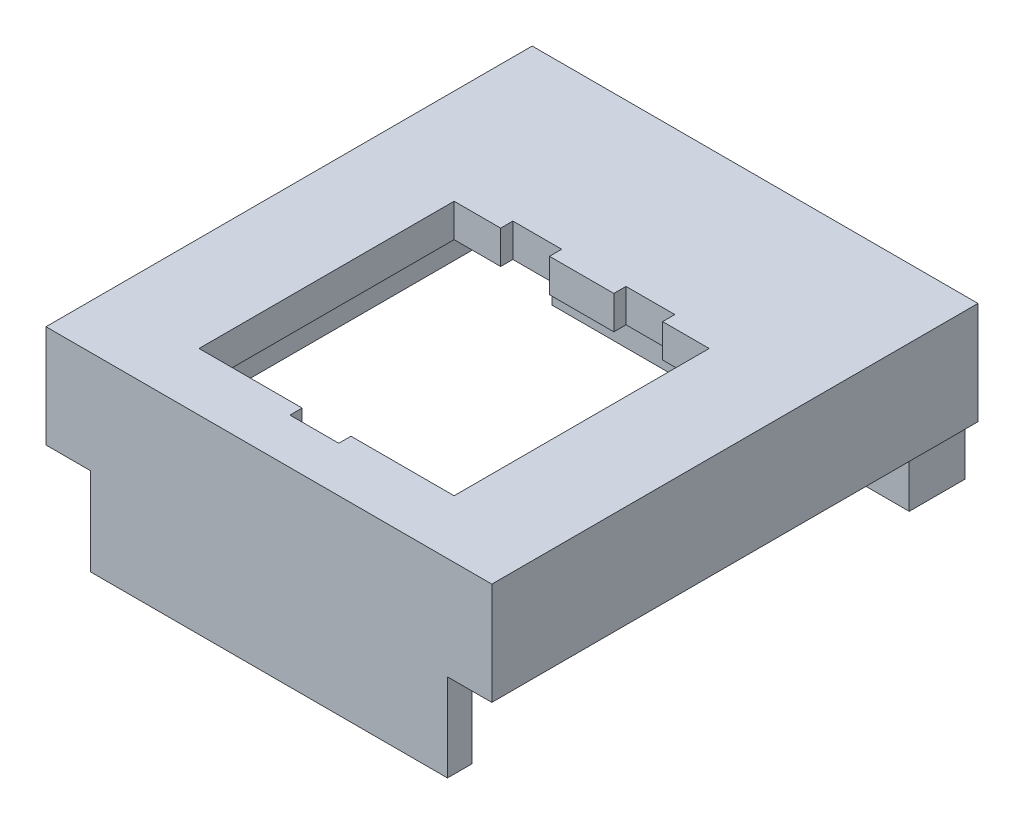
ISO-10303-21;
HEADER;
FILE_DESCRIPTION(('STEP AP214'),'2;1');
FILE_NAME('part.step','',(''),(''),'','','');
FILE_SCHEMA(('AUTOMOTIVE_DESIGN { 1 0 10303 214 1 1 1 1 }'));
ENDSEC;
DATA;
#1=APPLICATION_CONTEXT('core data for automotive mechanical design processes');
#2=APPLICATION_PROTOCOL_DEFINITION('international standard','automotive_design',2000,#1);
#3=PRODUCT_CONTEXT('',#1,'mechanical');
#4=PRODUCT('Part','Part','',(#3));
#5=PRODUCT_RELATED_PRODUCT_CATEGORY('part','',(#4));
#6=PRODUCT_DEFINITION_FORMATION('','',#4);
#7=PRODUCT_DEFINITION_CONTEXT('part definition',#1,'design');
#8=PRODUCT_DEFINITION('design','',#6,#7);
#9=PRODUCT_DEFINITION_SHAPE('','',#8);
#10=(LENGTH_UNIT() NAMED_UNIT(*) SI_UNIT(.MILLI.,.METRE.));
#11=(NAMED_UNIT(*) PLANE_ANGLE_UNIT() SI_UNIT($,.RADIAN.));
#12=(NAMED_UNIT(*) SI_UNIT($,.STERADIAN.) SOLID_ANGLE_UNIT());
#13=UNCERTAINTY_MEASURE_WITH_UNIT(LENGTH_MEASURE(1.E-05),#10,'distance_accuracy_value','');
#14=(GEOMETRIC_REPRESENTATION_CONTEXT(3) GLOBAL_UNCERTAINTY_ASSIGNED_CONTEXT((#13)) GLOBAL_UNIT_ASSIGNED_CONTEXT((#10,
#11,#12)) REPRESENTATION_CONTEXT('',''));
#15=CARTESIAN_POINT('',(0.,0.,0.));
#16=DIRECTION('',(0.,0.,1.));
#17=DIRECTION('',(1.,0.,0.));
#18=AXIS2_PLACEMENT_3D('',#15,#16,#17);
#19=CARTESIAN_POINT('',(-5.75000000000058,-3.95,-3.88999999999953));
#20=DIRECTION('',(0.,0.,-1.));
#21=DIRECTION('',(-1.,0.,0.));
#22=AXIS2_PLACEMENT_3D('',#19,#20,#21);
#23=PLANE('',#22);
#24=DIRECTION('',(-1.,0.,0.));
#25=VECTOR('',#24,1.);
#26=CARTESIAN_POINT('',(27.4281423258268,3.12,-3.88999999999953));
#27=LINE('',#26,#25);
#28=CARTESIAN_POINT('',(-3.65,3.12,-3.88999999999953));
#29=VERTEX_POINT('',#28);
#30=CARTESIAN_POINT('',(-5.75000000000058,3.12,-3.88999999999953));
#31=VERTEX_POINT('',#30);
#32=EDGE_CURVE('E380',#29,#31,#27,.T.);
#33=ORIENTED_EDGE('',*,*,#32,.F.);
#34=DIRECTION('',(0.,1.,0.));
#35=VECTOR('',#34,1.);
#36=CARTESIAN_POINT('',(-3.65,-3.95,-3.88999999999953));
#37=LINE('',#36,#35);
#38=CARTESIAN_POINT('',(-3.65,4.62,-3.88999999999953));
#39=VERTEX_POINT('',#38);
#40=EDGE_CURVE('E403',#29,#39,#37,.T.);
#41=ORIENTED_EDGE('',*,*,#40,.T.);
#42=DIRECTION('',(-1.,0.,0.));
#43=VECTOR('',#42,1.);
#44=CARTESIAN_POINT('',(-5.75000000000058,4.62,-3.88999999999953));
#45=LINE('',#44,#43);
#46=CARTESIAN_POINT('',(-5.75000000000058,4.62,-3.88999999999953));
#47=VERTEX_POINT('',#46);
#48=EDGE_CURVE('E487',#39,#47,#45,.T.);
#49=ORIENTED_EDGE('',*,*,#48,.T.);
#50=DIRECTION('',(0.,1.,0.));
#51=VECTOR('',#50,1.);
#52=CARTESIAN_POINT('',(-5.75000000000058,-3.95,-3.88999999999953));
#53=LINE('',#52,#51);
#54=EDGE_CURVE('E493',#31,#47,#53,.T.);
#55=ORIENTED_EDGE('',*,*,#54,.F.);
#56=EDGE_LOOP('',(#33,#41,#49,#55));
#57=FACE_BOUND('',#56,.T.);
#58=ADVANCED_FACE('F34',(#57),#23,.F.);
#59=CARTESIAN_POINT('',(1.45,4.62,-3.88999999999953));
#60=VERTEX_POINT('',#59);
#61=CARTESIAN_POINT('',(-1.45,4.62,-3.88999999999953));
#62=VERTEX_POINT('',#61);
#63=EDGE_CURVE('E492',#60,#62,#45,.T.);
#64=ORIENTED_EDGE('',*,*,#63,.T.);
#65=DIRECTION('',(0.,-1.,0.));
#66=VECTOR('',#65,1.);
#67=CARTESIAN_POINT('',(-1.45,-3.95,-3.88999999999953));
#68=LINE('',#67,#66);
#69=CARTESIAN_POINT('',(-1.45,3.12,-3.88999999999953));
#70=VERTEX_POINT('',#69);
#71=EDGE_CURVE('E400',#62,#70,#68,.T.);
#72=ORIENTED_EDGE('',*,*,#71,.T.);
#73=CARTESIAN_POINT('',(1.45,3.12,-3.88999999999953));
#74=VERTEX_POINT('',#73);
#75=EDGE_CURVE('E385',#74,#70,#27,.T.);
#76=ORIENTED_EDGE('',*,*,#75,.F.);
#77=DIRECTION('',(0.,1.,0.));
#78=VECTOR('',#77,1.);
#79=CARTESIAN_POINT('',(1.45,-3.95,-3.88999999999953));
#80=LINE('',#79,#78);
#81=EDGE_CURVE('E397',#74,#60,#80,.T.);
#82=ORIENTED_EDGE('',*,*,#81,.T.);
#83=EDGE_LOOP('',(#64,#72,#76,#82));
#84=FACE_BOUND('',#83,.T.);
#85=ADVANCED_FACE('F635',(#84),#23,.F.);
#86=CARTESIAN_POINT('',(5.75,-3.95,7.61));
#87=DIRECTION('',(0.,0.,1.));
#88=DIRECTION('',(1.,0.,0.));
#89=AXIS2_PLACEMENT_3D('',#86,#87,#88);
#90=PLANE('',#89);
#91=DIRECTION('',(1.,0.,0.));
#92=VECTOR('',#91,1.);
#93=CARTESIAN_POINT('',(5.75,4.62,7.61));
#94=LINE('',#93,#92);
#95=CARTESIAN_POINT('',(-5.75000000000058,4.62,7.61));
#96=VERTEX_POINT('',#95);
#97=CARTESIAN_POINT('',(-1.1,4.62,7.61));
#98=VERTEX_POINT('',#97);
#99=EDGE_CURVE('E481',#96,#98,#94,.T.);
#100=ORIENTED_EDGE('',*,*,#99,.T.);
#101=DIRECTION('',(0.,-1.,0.));
#102=VECTOR('',#101,1.);
#103=CARTESIAN_POINT('',(-1.1,-3.95,7.61));
#104=LINE('',#103,#102);
#105=CARTESIAN_POINT('',(-1.1,3.12,7.61));
#106=VERTEX_POINT('',#105);
#107=EDGE_CURVE('E391',#98,#106,#104,.T.);
#108=ORIENTED_EDGE('',*,*,#107,.T.);
#109=DIRECTION('',(1.,0.,0.));
#110=VECTOR('',#109,1.);
#111=CARTESIAN_POINT('',(27.4281423258268,3.12,7.61));
#112=LINE('',#111,#110);
#113=CARTESIAN_POINT('',(-5.75000000000058,3.12,7.61));
#114=VERTEX_POINT('',#113);
#115=EDGE_CURVE('E373',#114,#106,#112,.T.);
#116=ORIENTED_EDGE('',*,*,#115,.F.);
#117=DIRECTION('',(0.,1.,0.));
#118=VECTOR('',#117,1.);
#119=CARTESIAN_POINT('',(-5.75000000000058,-3.95,7.61));
#120=LINE('',#119,#118);
#121=EDGE_CURVE('E491',#114,#96,#120,.T.);
#122=ORIENTED_EDGE('',*,*,#121,.T.);
#123=EDGE_LOOP('',(#100,#108,#116,#122));
#124=FACE_BOUND('',#123,.T.);
#125=ADVANCED_FACE('F642',(#124),#90,.F.);
#126=CARTESIAN_POINT('',(-8.05,4.62,-10.21));
#127=DIRECTION('',(-1.,0.,0.));
#128=DIRECTION('',(0.,0.,1.));
#129=AXIS2_PLACEMENT_3D('',#126,#127,#128);
#130=PLANE('',#129);
#131=DIRECTION('',(0.,0.,-1.));
#132=VECTOR('',#131,1.);
#133=CARTESIAN_POINT('',(-8.05,3.12,9.11));
#134=LINE('',#133,#132);
#135=CARTESIAN_POINT('',(-8.05,3.12,9.11));
#136=VERTEX_POINT('',#135);
#137=CARTESIAN_POINT('',(-8.05,3.12,-10.61));
#138=VERTEX_POINT('',#137);
#139=EDGE_CURVE('E503',#136,#138,#134,.T.);
#140=ORIENTED_EDGE('',*,*,#139,.F.);
#141=DIRECTION('',(0.,1.,0.));
#142=VECTOR('',#141,1.);
#143=CARTESIAN_POINT('',(-8.05,-3.95,9.11));
#144=LINE('',#143,#142);
#145=CARTESIAN_POINT('',(-8.05,0.,9.11));
#146=VERTEX_POINT('',#145);
#147=EDGE_CURVE('E349',#146,#136,#144,.T.);
#148=ORIENTED_EDGE('',*,*,#147,.F.);
#149=DIRECTION('',(0.,0.,-1.));
#150=VECTOR('',#149,1.);
#151=CARTESIAN_POINT('',(-8.05,0.,-10.21));
#152=LINE('',#151,#150);
#153=CARTESIAN_POINT('',(-8.05,0.,-10.61));
#154=VERTEX_POINT('',#153);
#155=EDGE_CURVE('E366',#146,#154,#152,.T.);
#156=ORIENTED_EDGE('',*,*,#155,.T.);
#157=DIRECTION('',(0.,-1.,0.));
#158=VECTOR('',#157,1.);
#159=CARTESIAN_POINT('',(-8.05,19.2249681775532,-10.61));
#160=LINE('',#159,#158);
#161=EDGE_CURVE('E525',#138,#154,#160,.T.);
#162=ORIENTED_EDGE('',*,*,#161,.F.);
#163=EDGE_LOOP('',(#140,#148,#156,#162));
#164=FACE_BOUND('',#163,.T.);
#165=ADVANCED_FACE('F583',(#164),#130,.F.);
#166=CARTESIAN_POINT('',(-8.05,-3.95,9.11));
#167=DIRECTION('',(0.,0.,-1.));
#168=DIRECTION('',(-1.,0.,0.));
#169=AXIS2_PLACEMENT_3D('',#166,#167,#168);
#170=PLANE('',#169);
#171=ORIENTED_EDGE('',*,*,#147,.T.);
#172=DIRECTION('',(-1.,0.,0.));
#173=VECTOR('',#172,1.);
#174=CARTESIAN_POINT('',(27.4281423258268,3.12,9.11));
#175=LINE('',#174,#173);
#176=CARTESIAN_POINT('',(8.05,3.12,9.11));
#177=VERTEX_POINT('',#176);
#178=EDGE_CURVE('E295',#177,#136,#175,.T.);
#179=ORIENTED_EDGE('',*,*,#178,.F.);
#180=DIRECTION('',(0.,1.,0.));
#181=VECTOR('',#180,1.);
#182=CARTESIAN_POINT('',(8.05,-3.95,9.11));
#183=LINE('',#182,#181);
#184=CARTESIAN_POINT('',(8.05,0.,9.11));
#185=VERTEX_POINT('',#184);
#186=EDGE_CURVE('E352',#185,#177,#183,.T.);
#187=ORIENTED_EDGE('',*,*,#186,.F.);
#188=CARTESIAN_POINT('',(8.05,-3.95,9.11));
#189=VERTEX_POINT('',#188);
#190=EDGE_CURVE('E348',#189,#185,#183,.T.);
#191=ORIENTED_EDGE('',*,*,#190,.F.);
#192=DIRECTION('',(-1.,0.,0.));
#193=VECTOR('',#192,1.);
#194=CARTESIAN_POINT('',(-8.05,-3.95,9.11));
#195=LINE('',#194,#193);
#196=CARTESIAN_POINT('',(-8.05,-3.95,9.11));
#197=VERTEX_POINT('',#196);
#198=EDGE_CURVE('E340',#189,#197,#195,.T.);
#199=ORIENTED_EDGE('',*,*,#198,.T.);
#200=EDGE_CURVE('E344',#197,#146,#144,.T.);
#201=ORIENTED_EDGE('',*,*,#200,.T.);
#202=EDGE_LOOP('',(#171,#179,#187,#191,#199,#201));
#203=FACE_BOUND('',#202,.T.);
#204=ADVANCED_FACE('F580',(#203),#170,.T.);
#205=CARTESIAN_POINT('',(8.05,4.62,10.21));
#206=DIRECTION('',(1.,0.,0.));
#207=DIRECTION('',(0.,0.,-1.));
#208=AXIS2_PLACEMENT_3D('',#205,#206,#207);
#209=PLANE('',#208);
#210=DIRECTION('',(0.,0.,-1.));
#211=VECTOR('',#210,1.);
#212=CARTESIAN_POINT('',(8.05,3.12,9.11));
#213=LINE('',#212,#211);
#214=CARTESIAN_POINT('',(8.05,3.12,-10.61));
#215=VERTEX_POINT('',#214);
#216=EDGE_CURVE('E298',#177,#215,#213,.T.);
#217=ORIENTED_EDGE('',*,*,#216,.T.);
#218=DIRECTION('',(0.,-1.,0.));
#219=VECTOR('',#218,1.);
#220=CARTESIAN_POINT('',(8.05,19.2249681775532,-10.61));
#221=LINE('',#220,#219);
#222=CARTESIAN_POINT('',(8.05,0.,-10.61));
#223=VERTEX_POINT('',#222);
#224=EDGE_CURVE('E509',#215,#223,#221,.T.);
#225=ORIENTED_EDGE('',*,*,#224,.T.);
#226=DIRECTION('',(0.,0.,1.));
#227=VECTOR('',#226,1.);
#228=CARTESIAN_POINT('',(8.05,0.,10.21));
#229=LINE('',#228,#227);
#230=EDGE_CURVE('E321',#223,#185,#229,.T.);
#231=ORIENTED_EDGE('',*,*,#230,.T.);
#232=ORIENTED_EDGE('',*,*,#186,.T.);
#233=EDGE_LOOP('',(#217,#225,#231,#232));
#234=FACE_BOUND('',#233,.T.);
#235=ADVANCED_FACE('F508',(#234),#209,.F.);
#236=CARTESIAN_POINT('',(0.,0.,0.));
#237=DIRECTION('',(0.,1.,0.));
#238=DIRECTION('',(0.,0.,1.));
#239=AXIS2_PLACEMENT_3D('',#236,#237,#238);
#240=PLANE('',#239);
#241=DIRECTION('',(0.,0.,-1.));
#242=VECTOR('',#241,1.);
#243=CARTESIAN_POINT('',(-8.05,0.,-10.21));
#244=LINE('',#243,#242);
#245=CARTESIAN_POINT('',(-8.05,0.,-11.71));
#246=VERTEX_POINT('',#245);
#247=EDGE_CURVE('E292',#154,#246,#244,.T.);
#248=ORIENTED_EDGE('',*,*,#247,.F.);
#249=ORIENTED_EDGE('',*,*,#155,.F.);
#250=CARTESIAN_POINT('',(-8.05,0.,10.21));
#251=VERTEX_POINT('',#250);
#252=EDGE_CURVE('E367',#251,#146,#152,.T.);
#253=ORIENTED_EDGE('',*,*,#252,.F.);
#254=DIRECTION('',(1.,0.,0.));
#255=VECTOR('',#254,1.);
#256=CARTESIAN_POINT('',(-8.05,0.,10.21));
#257=LINE('',#256,#255);
#258=CARTESIAN_POINT('',(-10.05,0.,10.21));
#259=VERTEX_POINT('',#258);
#260=EDGE_CURVE('E347',#259,#251,#257,.T.);
#261=ORIENTED_EDGE('',*,*,#260,.F.);
#262=DIRECTION('',(0.,0.,1.));
#263=VECTOR('',#262,1.);
#264=CARTESIAN_POINT('',(-10.05,0.,-10.21));
#265=LINE('',#264,#263);
#266=CARTESIAN_POINT('',(-10.05,0.,-11.71));
#267=VERTEX_POINT('',#266);
#268=EDGE_CURVE('E361',#267,#259,#265,.T.);
#269=ORIENTED_EDGE('',*,*,#268,.F.);
#270=DIRECTION('',(-1.,0.,0.));
#271=VECTOR('',#270,1.);
#272=CARTESIAN_POINT('',(10.05,0.,-11.71));
#273=LINE('',#272,#271);
#274=EDGE_CURVE('E309',#246,#267,#273,.T.);
#275=ORIENTED_EDGE('',*,*,#274,.F.);
#276=EDGE_LOOP('',(#248,#249,#253,#261,#269,#275));
#277=FACE_BOUND('',#276,.T.);
#278=ADVANCED_FACE('F586',(#277),#240,.F.);
#279=DIRECTION('',(0.,0.,1.));
#280=VECTOR('',#279,1.);
#281=CARTESIAN_POINT('',(8.05,0.,-11.71));
#282=LINE('',#281,#280);
#283=CARTESIAN_POINT('',(8.05,0.,-11.71));
#284=VERTEX_POINT('',#283);
#285=EDGE_CURVE('E287',#284,#223,#282,.T.);
#286=ORIENTED_EDGE('',*,*,#285,.F.);
#287=CARTESIAN_POINT('',(10.05,0.,-11.71));
#288=VERTEX_POINT('',#287);
#289=EDGE_CURVE('E305',#288,#284,#273,.T.);
#290=ORIENTED_EDGE('',*,*,#289,.F.);
#291=DIRECTION('',(0.,0.,-1.));
#292=VECTOR('',#291,1.);
#293=CARTESIAN_POINT('',(10.05,0.,10.21));
#294=LINE('',#293,#292);
#295=CARTESIAN_POINT('',(10.05,0.,10.21));
#296=VERTEX_POINT('',#295);
#297=EDGE_CURVE('E324',#296,#288,#294,.T.);
#298=ORIENTED_EDGE('',*,*,#297,.F.);
#299=DIRECTION('',(1.,0.,0.));
#300=VECTOR('',#299,1.);
#301=CARTESIAN_POINT('',(8.05,0.,10.21));
#302=LINE('',#301,#300);
#303=CARTESIAN_POINT('',(8.05,0.,10.21));
#304=VERTEX_POINT('',#303);
#305=EDGE_CURVE('E315',#304,#296,#302,.T.);
#306=ORIENTED_EDGE('',*,*,#305,.F.);
#307=EDGE_CURVE('E328',#185,#304,#229,.T.);
#308=ORIENTED_EDGE('',*,*,#307,.F.);
#309=ORIENTED_EDGE('',*,*,#230,.F.);
#310=EDGE_LOOP('',(#286,#290,#298,#306,#308,#309));
#311=FACE_BOUND('',#310,.T.);
#312=ADVANCED_FACE('F603',(#311),#240,.F.);
#313=CARTESIAN_POINT('',(8.05,-3.95,9.11));
#314=DIRECTION('',(1.,0.,0.));
#315=DIRECTION('',(0.,0.,-1.));
#316=AXIS2_PLACEMENT_3D('',#313,#314,#315);
#317=PLANE('',#316);
#318=ORIENTED_EDGE('',*,*,#190,.T.);
#319=ORIENTED_EDGE('',*,*,#307,.T.);
#320=DIRECTION('',(0.,1.,0.));
#321=VECTOR('',#320,1.);
#322=CARTESIAN_POINT('',(8.05,-3.95,10.21));
#323=LINE('',#322,#321);
#324=CARTESIAN_POINT('',(8.05,-3.95,10.21));
#325=VERTEX_POINT('',#324);
#326=EDGE_CURVE('E353',#325,#304,#323,.T.);
#327=ORIENTED_EDGE('',*,*,#326,.F.);
#328=DIRECTION('',(0.,0.,-1.));
#329=VECTOR('',#328,1.);
#330=CARTESIAN_POINT('',(8.05,-3.95,9.11));
#331=LINE('',#330,#329);
#332=EDGE_CURVE('E337',#325,#189,#331,.T.);
#333=ORIENTED_EDGE('',*,*,#332,.T.);
#334=EDGE_LOOP('',(#318,#319,#327,#333));
#335=FACE_BOUND('',#334,.T.);
#336=ADVANCED_FACE('F598',(#335),#317,.T.);
#337=CARTESIAN_POINT('',(-8.05,4.62,10.21));
#338=DIRECTION('',(0.,0.,-1.));
#339=DIRECTION('',(-1.,0.,0.));
#340=AXIS2_PLACEMENT_3D('',#337,#338,#339);
#341=PLANE('',#340);
#342=ORIENTED_EDGE('',*,*,#260,.T.);
#343=DIRECTION('',(0.,1.,0.));
#344=VECTOR('',#343,1.);
#345=CARTESIAN_POINT('',(-8.05,-3.95,10.21));
#346=LINE('',#345,#344);
#347=CARTESIAN_POINT('',(-8.05,-3.95,10.21));
#348=VERTEX_POINT('',#347);
#349=EDGE_CURVE('E343',#348,#251,#346,.T.);
#350=ORIENTED_EDGE('',*,*,#349,.F.);
#351=DIRECTION('',(1.,0.,0.));
#352=VECTOR('',#351,1.);
#353=CARTESIAN_POINT('',(-8.05,-3.95,10.21));
#354=LINE('',#353,#352);
#355=EDGE_CURVE('E334',#348,#325,#354,.T.);
#356=ORIENTED_EDGE('',*,*,#355,.T.);
#357=ORIENTED_EDGE('',*,*,#326,.T.);
#358=ORIENTED_EDGE('',*,*,#305,.T.);
#359=DIRECTION('',(0.,-1.,0.));
#360=VECTOR('',#359,1.);
#361=CARTESIAN_POINT('',(10.05,4.62,10.21));
#362=LINE('',#361,#360);
#363=CARTESIAN_POINT('',(10.05,4.62,10.21));
#364=VERTEX_POINT('',#363);
#365=EDGE_CURVE('E320',#364,#296,#362,.T.);
#366=ORIENTED_EDGE('',*,*,#365,.F.);
#367=DIRECTION('',(1.,0.,0.));
#368=VECTOR('',#367,1.);
#369=CARTESIAN_POINT('',(-8.05,4.62,10.21));
#370=LINE('',#369,#368);
#371=CARTESIAN_POINT('',(-10.05,4.62,10.21));
#372=VERTEX_POINT('',#371);
#373=EDGE_CURVE('E358',#372,#364,#370,.T.);
#374=ORIENTED_EDGE('',*,*,#373,.F.);
#375=DIRECTION('',(0.,-1.,0.));
#376=VECTOR('',#375,1.);
#377=CARTESIAN_POINT('',(-10.05,4.62,10.21));
#378=LINE('',#377,#376);
#379=EDGE_CURVE('E363',#372,#259,#378,.T.);
#380=ORIENTED_EDGE('',*,*,#379,.T.);
#381=EDGE_LOOP('',(#342,#350,#356,#357,#358,#366,#374,#380));
#382=FACE_BOUND('',#381,.T.);
#383=ADVANCED_FACE('F36',(#382),#341,.F.);
#384=CARTESIAN_POINT('',(-10.05,4.62,-10.21));
#385=DIRECTION('',(1.,0.,0.));
#386=DIRECTION('',(0.,0.,-1.));
#387=AXIS2_PLACEMENT_3D('',#384,#385,#386);
#388=PLANE('',#387);
#389=ORIENTED_EDGE('',*,*,#268,.T.);
#390=ORIENTED_EDGE('',*,*,#379,.F.);
#391=DIRECTION('',(0.,0.,1.));
#392=VECTOR('',#391,1.);
#393=CARTESIAN_POINT('',(-10.05,4.62,-10.21));
#394=LINE('',#393,#392);
#395=CARTESIAN_POINT('',(-10.05,4.62,-11.71));
#396=VERTEX_POINT('',#395);
#397=EDGE_CURVE('E360',#396,#372,#394,.T.);
#398=ORIENTED_EDGE('',*,*,#397,.F.);
#399=DIRECTION('',(0.,1.,0.));
#400=VECTOR('',#399,1.);
#401=CARTESIAN_POINT('',(-10.05,0.,-11.71));
#402=LINE('',#401,#400);
#403=EDGE_CURVE('E312',#267,#396,#402,.T.);
#404=ORIENTED_EDGE('',*,*,#403,.F.);
#405=EDGE_LOOP('',(#389,#390,#398,#404));
#406=FACE_BOUND('',#405,.T.);
#407=ADVANCED_FACE('F614',(#406),#388,.F.);
#408=CARTESIAN_POINT('',(0.,4.62,0.));
#409=DIRECTION('',(0.,1.,0.));
#410=DIRECTION('',(0.,0.,1.));
#411=AXIS2_PLACEMENT_3D('',#408,#409,#410);
#412=PLANE('',#411);
#413=DIRECTION('',(0.,0.,1.));
#414=VECTOR('',#413,1.);
#415=CARTESIAN_POINT('',(-1.1,4.62,7.61));
#416=LINE('',#415,#414);
#417=CARTESIAN_POINT('',(-1.1,4.62,8.16));
#418=VERTEX_POINT('',#417);
#419=EDGE_CURVE('E431',#98,#418,#416,.T.);
#420=ORIENTED_EDGE('',*,*,#419,.F.);
#421=ORIENTED_EDGE('',*,*,#99,.F.);
#422=DIRECTION('',(0.,0.,1.));
#423=VECTOR('',#422,1.);
#424=CARTESIAN_POINT('',(-5.75000000000058,4.62,7.61));
#425=LINE('',#424,#423);
#426=EDGE_CURVE('E478',#47,#96,#425,.T.);
#427=ORIENTED_EDGE('',*,*,#426,.F.);
#428=ORIENTED_EDGE('',*,*,#48,.F.);
#429=DIRECTION('',(0.,0.,1.));
#430=VECTOR('',#429,1.);
#431=CARTESIAN_POINT('',(-3.65,4.62,-4.43999999999953));
#432=LINE('',#431,#430);
#433=CARTESIAN_POINT('',(-3.65,4.62,-4.43999999999953));
#434=VERTEX_POINT('',#433);
#435=EDGE_CURVE('E439',#434,#39,#432,.T.);
#436=ORIENTED_EDGE('',*,*,#435,.F.);
#437=DIRECTION('',(-1.,0.,0.));
#438=VECTOR('',#437,1.);
#439=CARTESIAN_POINT('',(-3.65,4.62,-4.43999999999953));
#440=LINE('',#439,#438);
#441=CARTESIAN_POINT('',(-1.45,4.62,-4.43999999999953));
#442=VERTEX_POINT('',#441);
#443=EDGE_CURVE('E445',#442,#434,#440,.T.);
#444=ORIENTED_EDGE('',*,*,#443,.F.);
#445=DIRECTION('',(0.,0.,-1.));
#446=VECTOR('',#445,1.);
#447=CARTESIAN_POINT('',(-1.45,4.62,-4.43999999999953));
#448=LINE('',#447,#446);
#449=EDGE_CURVE('E441',#62,#442,#448,.T.);
#450=ORIENTED_EDGE('',*,*,#449,.F.);
#451=ORIENTED_EDGE('',*,*,#63,.F.);
#452=DIRECTION('',(0.,0.,1.));
#453=VECTOR('',#452,1.);
#454=CARTESIAN_POINT('',(1.45,4.62,-4.43999999999953));
#455=LINE('',#454,#453);
#456=CARTESIAN_POINT('',(1.45,4.62,-4.43999999999953));
#457=VERTEX_POINT('',#456);
#458=EDGE_CURVE('E452',#457,#60,#455,.T.);
#459=ORIENTED_EDGE('',*,*,#458,.F.);
#460=DIRECTION('',(-1.,0.,0.));
#461=VECTOR('',#460,1.);
#462=CARTESIAN_POINT('',(1.45,4.62,-4.43999999999953));
#463=LINE('',#462,#461);
#464=CARTESIAN_POINT('',(3.65,4.62,-4.43999999999953));
#465=VERTEX_POINT('',#464);
#466=EDGE_CURVE('E458',#465,#457,#463,.T.);
#467=ORIENTED_EDGE('',*,*,#466,.F.);
#468=DIRECTION('',(0.,0.,-1.));
#469=VECTOR('',#468,1.);
#470=CARTESIAN_POINT('',(3.65,4.62,-4.43999999999953));
#471=LINE('',#470,#469);
#472=CARTESIAN_POINT('',(3.65,4.62,-3.88999999999953));
#473=VERTEX_POINT('',#472);
#474=EDGE_CURVE('E454',#473,#465,#471,.T.);
#475=ORIENTED_EDGE('',*,*,#474,.F.);
#476=CARTESIAN_POINT('',(5.75,4.62,-3.88999999999953));
#477=VERTEX_POINT('',#476);
#478=EDGE_CURVE('E488',#477,#473,#45,.T.);
#479=ORIENTED_EDGE('',*,*,#478,.F.);
#480=DIRECTION('',(0.,0.,-1.));
#481=VECTOR('',#480,1.);
#482=CARTESIAN_POINT('',(5.75,4.62,7.61));
#483=LINE('',#482,#481);
#484=CARTESIAN_POINT('',(5.75,4.62,7.61));
#485=VERTEX_POINT('',#484);
#486=EDGE_CURVE('E484',#485,#477,#483,.T.);
#487=ORIENTED_EDGE('',*,*,#486,.F.);
#488=CARTESIAN_POINT('',(1.1,4.62,7.61));
#489=VERTEX_POINT('',#488);
#490=EDGE_CURVE('E480',#489,#485,#94,.T.);
#491=ORIENTED_EDGE('',*,*,#490,.F.);
#492=DIRECTION('',(0.,0.,-1.));
#493=VECTOR('',#492,1.);
#494=CARTESIAN_POINT('',(1.1,4.62,7.61));
#495=LINE('',#494,#493);
#496=CARTESIAN_POINT('',(1.1,4.62,8.16));
#497=VERTEX_POINT('',#496);
#498=EDGE_CURVE('E433',#497,#489,#495,.T.);
#499=ORIENTED_EDGE('',*,*,#498,.F.);
#500=DIRECTION('',(1.,0.,0.));
#501=VECTOR('',#500,1.);
#502=CARTESIAN_POINT('',(-1.1,4.62,8.16));
#503=LINE('',#502,#501);
#504=EDGE_CURVE('E436',#418,#497,#503,.T.);
#505=ORIENTED_EDGE('',*,*,#504,.F.);
#506=EDGE_LOOP('',(#420,#421,#427,#428,#436,#444,#450,#451,#459,#467,#475,#479,#487,#491,#499,#505));
#507=FACE_BOUND('',#506,.T.);
#508=DIRECTION('',(-1.,0.,0.));
#509=VECTOR('',#508,1.);
#510=CARTESIAN_POINT('',(10.05,4.62,-11.71));
#511=LINE('',#510,#509);
#512=CARTESIAN_POINT('',(10.05,4.62,-11.71));
#513=VERTEX_POINT('',#512);
#514=EDGE_CURVE('E304',#513,#396,#511,.T.);
#515=ORIENTED_EDGE('',*,*,#514,.T.);
#516=ORIENTED_EDGE('',*,*,#397,.T.);
#517=ORIENTED_EDGE('',*,*,#373,.T.);
#518=DIRECTION('',(0.,0.,-1.));
#519=VECTOR('',#518,1.);
#520=CARTESIAN_POINT('',(10.05,4.62,10.21));
#521=LINE('',#520,#519);
#522=EDGE_CURVE('E318',#364,#513,#521,.T.);
#523=ORIENTED_EDGE('',*,*,#522,.T.);
#524=EDGE_LOOP('',(#515,#516,#517,#523));
#525=FACE_BOUND('',#524,.T.);
#526=ADVANCED_FACE('F567',(#507,#525),#412,.T.);
#527=CARTESIAN_POINT('',(-8.05,-3.95,10.21));
#528=DIRECTION('',(-1.,0.,0.));
#529=DIRECTION('',(0.,0.,1.));
#530=AXIS2_PLACEMENT_3D('',#527,#528,#529);
#531=PLANE('',#530);
#532=ORIENTED_EDGE('',*,*,#349,.T.);
#533=ORIENTED_EDGE('',*,*,#252,.T.);
#534=ORIENTED_EDGE('',*,*,#200,.F.);
#535=DIRECTION('',(0.,0.,1.));
#536=VECTOR('',#535,1.);
#537=CARTESIAN_POINT('',(-8.05,-3.95,10.21));
#538=LINE('',#537,#536);
#539=EDGE_CURVE('E331',#197,#348,#538,.T.);
#540=ORIENTED_EDGE('',*,*,#539,.T.);
#541=EDGE_LOOP('',(#532,#533,#534,#540));
#542=FACE_BOUND('',#541,.T.);
#543=ADVANCED_FACE('F590',(#542),#531,.T.);
#544=CARTESIAN_POINT('',(0.,-3.95,0.));
#545=DIRECTION('',(0.,-1.,0.));
#546=DIRECTION('',(0.,0.,-1.));
#547=AXIS2_PLACEMENT_3D('',#544,#545,#546);
#548=PLANE('',#547);
#549=ORIENTED_EDGE('',*,*,#539,.F.);
#550=ORIENTED_EDGE('',*,*,#198,.F.);
#551=ORIENTED_EDGE('',*,*,#332,.F.);
#552=ORIENTED_EDGE('',*,*,#355,.F.);
#553=EDGE_LOOP('',(#549,#550,#551,#552));
#554=FACE_BOUND('',#553,.T.);
#555=ADVANCED_FACE('F596',(#554),#548,.T.);
#556=CARTESIAN_POINT('',(10.05,4.62,10.21));
#557=DIRECTION('',(-1.,0.,0.));
#558=DIRECTION('',(0.,0.,1.));
#559=AXIS2_PLACEMENT_3D('',#556,#557,#558);
#560=PLANE('',#559);
#561=ORIENTED_EDGE('',*,*,#297,.T.);
#562=DIRECTION('',(0.,1.,0.));
#563=VECTOR('',#562,1.);
#564=CARTESIAN_POINT('',(10.05,0.,-11.71));
#565=LINE('',#564,#563);
#566=EDGE_CURVE('E308',#288,#513,#565,.T.);
#567=ORIENTED_EDGE('',*,*,#566,.T.);
#568=ORIENTED_EDGE('',*,*,#522,.F.);
#569=ORIENTED_EDGE('',*,*,#365,.T.);
#570=EDGE_LOOP('',(#561,#567,#568,#569));
#571=FACE_BOUND('',#570,.T.);
#572=ADVANCED_FACE('F608',(#571),#560,.F.);
#573=CARTESIAN_POINT('',(10.05,0.,-11.71));
#574=DIRECTION('',(0.,0.,-1.));
#575=DIRECTION('',(-1.,0.,0.));
#576=AXIS2_PLACEMENT_3D('',#573,#574,#575);
#577=PLANE('',#576);
#578=DIRECTION('',(1.,0.,0.));
#579=VECTOR('',#578,1.);
#580=CARTESIAN_POINT('',(8.05,-1.65,-11.71));
#581=LINE('',#580,#579);
#582=CARTESIAN_POINT('',(-8.05,-1.65,-11.71));
#583=VERTEX_POINT('',#582);
#584=CARTESIAN_POINT('',(8.05,-1.65,-11.71));
#585=VERTEX_POINT('',#584);
#586=EDGE_CURVE('E538',#583,#585,#581,.T.);
#587=ORIENTED_EDGE('',*,*,#586,.F.);
#588=DIRECTION('',(0.,1.,0.));
#589=VECTOR('',#588,1.);
#590=CARTESIAN_POINT('',(-8.05,-3.95,-11.71));
#591=LINE('',#590,#589);
#592=EDGE_CURVE('E301',#583,#246,#591,.T.);
#593=ORIENTED_EDGE('',*,*,#592,.T.);
#594=ORIENTED_EDGE('',*,*,#274,.T.);
#595=ORIENTED_EDGE('',*,*,#403,.T.);
#596=ORIENTED_EDGE('',*,*,#514,.F.);
#597=ORIENTED_EDGE('',*,*,#566,.F.);
#598=ORIENTED_EDGE('',*,*,#289,.T.);
#599=DIRECTION('',(0.,1.,0.));
#600=VECTOR('',#599,1.);
#601=CARTESIAN_POINT('',(8.05,-3.95,-11.71));
#602=LINE('',#601,#600);
#603=EDGE_CURVE('E289',#585,#284,#602,.T.);
#604=ORIENTED_EDGE('',*,*,#603,.F.);
#605=EDGE_LOOP('',(#587,#593,#594,#595,#596,#597,#598,#604));
#606=FACE_BOUND('',#605,.T.);
#607=DIRECTION('',(-1.,0.,0.));
#608=VECTOR('',#607,1.);
#609=CARTESIAN_POINT('',(-4.481119636084,-0.971119636083997,-11.71));
#610=LINE('',#609,#608);
#611=CARTESIAN_POINT('',(3.64000000000001,-0.971119636083998,-11.71));
#612=VERTEX_POINT('',#611);
#613=CARTESIAN_POINT('',(-4.481119636084,-0.971119636083997,-11.71));
#614=VERTEX_POINT('',#613);
#615=EDGE_CURVE('E544',#612,#614,#610,.T.);
#616=ORIENTED_EDGE('',*,*,#615,.F.);
#617=DIRECTION('',(0.,-1.,0.));
#618=VECTOR('',#617,1.);
#619=CARTESIAN_POINT('',(3.64,2.1,-11.71));
#620=LINE('',#619,#618);
#621=CARTESIAN_POINT('',(3.64,2.1,-11.71));
#622=VERTEX_POINT('',#621);
#623=EDGE_CURVE('E553',#622,#612,#620,.T.);
#624=ORIENTED_EDGE('',*,*,#623,.F.);
#625=DIRECTION('',(1.,0.,0.));
#626=VECTOR('',#625,1.);
#627=CARTESIAN_POINT('',(-4.481119636084,2.1,-11.71));
#628=LINE('',#627,#626);
#629=CARTESIAN_POINT('',(-4.481119636084,2.1,-11.71));
#630=VERTEX_POINT('',#629);
#631=EDGE_CURVE('E550',#630,#622,#628,.T.);
#632=ORIENTED_EDGE('',*,*,#631,.F.);
#633=DIRECTION('',(0.,1.,0.));
#634=VECTOR('',#633,1.);
#635=CARTESIAN_POINT('',(-4.481119636084,-0.971119636083997,-11.71));
#636=LINE('',#635,#634);
#637=EDGE_CURVE('E547',#614,#630,#636,.T.);
#638=ORIENTED_EDGE('',*,*,#637,.F.);
#639=EDGE_LOOP('',(#616,#624,#632,#638));
#640=FACE_BOUND('',#639,.T.);
#641=ADVANCED_FACE('F617',(#606,#640),#577,.T.);
#642=CARTESIAN_POINT('',(-8.05,-3.95,-10.21));
#643=DIRECTION('',(1.,0.,0.));
#644=DIRECTION('',(0.,0.,-1.));
#645=AXIS2_PLACEMENT_3D('',#642,#643,#644);
#646=PLANE('',#645);
#647=DIRECTION('',(0.,0.,1.));
#648=VECTOR('',#647,1.);
#649=CARTESIAN_POINT('',(-8.05,-1.65,-13.79));
#650=LINE('',#649,#648);
#651=CARTESIAN_POINT('',(-8.05,-1.65,-13.1159664953668));
#652=VERTEX_POINT('',#651);
#653=EDGE_CURVE('E280',#652,#583,#650,.T.);
#654=ORIENTED_EDGE('',*,*,#653,.F.);
#655=DIRECTION('',(0.,1.,0.));
#656=VECTOR('',#655,1.);
#657=CARTESIAN_POINT('',(-8.05,0.,-13.1159664953668));
#658=LINE('',#657,#656);
#659=CARTESIAN_POINT('',(-8.05,-3.95,-13.1159664953668));
#660=VERTEX_POINT('',#659);
#661=EDGE_CURVE('E49',#660,#652,#658,.T.);
#662=ORIENTED_EDGE('',*,*,#661,.F.);
#663=DIRECTION('',(0.,0.,-1.));
#664=VECTOR('',#663,1.);
#665=CARTESIAN_POINT('',(-8.05,-3.95,-10.21));
#666=LINE('',#665,#664);
#667=CARTESIAN_POINT('',(-8.05,-3.95,-10.61));
#668=VERTEX_POINT('',#667);
#669=EDGE_CURVE('E278',#668,#660,#666,.T.);
#670=ORIENTED_EDGE('',*,*,#669,.F.);
#671=EDGE_CURVE('E527',#154,#668,#160,.T.);
#672=ORIENTED_EDGE('',*,*,#671,.F.);
#673=ORIENTED_EDGE('',*,*,#247,.T.);
#674=ORIENTED_EDGE('',*,*,#592,.F.);
#675=EDGE_LOOP('',(#654,#662,#670,#672,#673,#674));
#676=FACE_BOUND('',#675,.T.);
#677=ADVANCED_FACE('F276',(#676),#646,.F.);
#678=CARTESIAN_POINT('',(8.05,-3.95,-11.71));
#679=DIRECTION('',(-1.,0.,0.));
#680=DIRECTION('',(0.,0.,1.));
#681=AXIS2_PLACEMENT_3D('',#678,#679,#680);
#682=PLANE('',#681);
#683=DIRECTION('',(0.,0.,1.));
#684=VECTOR('',#683,1.);
#685=CARTESIAN_POINT('',(8.05,-3.95,-11.71));
#686=LINE('',#685,#684);
#687=CARTESIAN_POINT('',(8.05,-3.95,-13.1159664953668));
#688=VERTEX_POINT('',#687);
#689=CARTESIAN_POINT('',(8.05,-3.95,-10.61));
#690=VERTEX_POINT('',#689);
#691=EDGE_CURVE('E286',#688,#690,#686,.T.);
#692=ORIENTED_EDGE('',*,*,#691,.F.);
#693=DIRECTION('',(0.,1.,0.));
#694=VECTOR('',#693,1.);
#695=CARTESIAN_POINT('',(8.05,-3.95,-13.1159664953668));
#696=LINE('',#695,#694);
#697=CARTESIAN_POINT('',(8.05,-1.65,-13.1159664953668));
#698=VERTEX_POINT('',#697);
#699=EDGE_CURVE('E267',#688,#698,#696,.T.);
#700=ORIENTED_EDGE('',*,*,#699,.T.);
#701=DIRECTION('',(0.,0.,1.));
#702=VECTOR('',#701,1.);
#703=CARTESIAN_POINT('',(8.05,-1.65,-13.79));
#704=LINE('',#703,#702);
#705=EDGE_CURVE('E541',#698,#585,#704,.T.);
#706=ORIENTED_EDGE('',*,*,#705,.T.);
#707=ORIENTED_EDGE('',*,*,#603,.T.);
#708=ORIENTED_EDGE('',*,*,#285,.T.);
#709=EDGE_CURVE('E521',#223,#690,#221,.T.);
#710=ORIENTED_EDGE('',*,*,#709,.T.);
#711=EDGE_LOOP('',(#692,#700,#706,#707,#708,#710));
#712=FACE_BOUND('',#711,.T.);
#713=ADVANCED_FACE('F625',(#712),#682,.F.);
#714=CARTESIAN_POINT('',(0.,-3.95,0.));
#715=DIRECTION('',(0.,-1.,0.));
#716=DIRECTION('',(0.,0.,-1.));
#717=AXIS2_PLACEMENT_3D('',#714,#715,#716);
#718=PLANE('',#717);
#719=DIRECTION('',(-1.,0.,0.));
#720=VECTOR('',#719,1.);
#721=CARTESIAN_POINT('',(10.05,-3.95,-13.1159664953668));
#722=LINE('',#721,#720);
#723=EDGE_CURVE('E264',#688,#660,#722,.T.);
#724=ORIENTED_EDGE('',*,*,#723,.F.);
#725=ORIENTED_EDGE('',*,*,#691,.T.);
#726=DIRECTION('',(1.,0.,0.));
#727=VECTOR('',#726,1.);
#728=CARTESIAN_POINT('',(8.05,-3.95,-10.61));
#729=LINE('',#728,#727);
#730=EDGE_CURVE('E285',#668,#690,#729,.T.);
#731=ORIENTED_EDGE('',*,*,#730,.F.);
#732=ORIENTED_EDGE('',*,*,#669,.T.);
#733=EDGE_LOOP('',(#724,#725,#731,#732));
#734=FACE_BOUND('',#733,.T.);
#735=ADVANCED_FACE('F283',(#734),#718,.T.);
#736=CARTESIAN_POINT('',(27.4281423258268,3.12,9.11));
#737=DIRECTION('',(0.,1.,0.));
#738=DIRECTION('',(0.,0.,1.));
#739=AXIS2_PLACEMENT_3D('',#736,#737,#738);
#740=PLANE('',#739);
#741=ORIENTED_EDGE('',*,*,#115,.T.);
#742=DIRECTION('',(0.,0.,1.));
#743=VECTOR('',#742,1.);
#744=CARTESIAN_POINT('',(-1.1,3.12,9.11));
#745=LINE('',#744,#743);
#746=CARTESIAN_POINT('',(-1.1,3.12,8.16));
#747=VERTEX_POINT('',#746);
#748=EDGE_CURVE('E419',#106,#747,#745,.T.);
#749=ORIENTED_EDGE('',*,*,#748,.T.);
#750=DIRECTION('',(1.,0.,0.));
#751=VECTOR('',#750,1.);
#752=CARTESIAN_POINT('',(27.4281423258268,3.12,8.16));
#753=LINE('',#752,#751);
#754=CARTESIAN_POINT('',(1.1,3.12,8.16));
#755=VERTEX_POINT('',#754);
#756=EDGE_CURVE('E42',#747,#755,#753,.T.);
#757=ORIENTED_EDGE('',*,*,#756,.T.);
#758=DIRECTION('',(0.,0.,-1.));
#759=VECTOR('',#758,1.);
#760=CARTESIAN_POINT('',(1.1,3.12,9.11));
#761=LINE('',#760,#759);
#762=CARTESIAN_POINT('',(1.1,3.12,7.61));
#763=VERTEX_POINT('',#762);
#764=EDGE_CURVE('E417',#755,#763,#761,.T.);
#765=ORIENTED_EDGE('',*,*,#764,.T.);
#766=CARTESIAN_POINT('',(5.75,3.12,7.61));
#767=VERTEX_POINT('',#766);
#768=EDGE_CURVE('E377',#763,#767,#112,.T.);
#769=ORIENTED_EDGE('',*,*,#768,.T.);
#770=DIRECTION('',(0.,0.,-1.));
#771=VECTOR('',#770,1.);
#772=CARTESIAN_POINT('',(5.75000000000001,3.12,9.11));
#773=LINE('',#772,#771);
#774=CARTESIAN_POINT('',(5.75,3.12,-3.88999999999953));
#775=VERTEX_POINT('',#774);
#776=EDGE_CURVE('E376',#767,#775,#773,.T.);
#777=ORIENTED_EDGE('',*,*,#776,.T.);
#778=CARTESIAN_POINT('',(3.65,3.12,-3.88999999999953));
#779=VERTEX_POINT('',#778);
#780=EDGE_CURVE('E381',#775,#779,#27,.T.);
#781=ORIENTED_EDGE('',*,*,#780,.T.);
#782=DIRECTION('',(0.,0.,-1.));
#783=VECTOR('',#782,1.);
#784=CARTESIAN_POINT('',(3.65,3.12,9.11));
#785=LINE('',#784,#783);
#786=CARTESIAN_POINT('',(3.65,3.12,-4.43999999999953));
#787=VERTEX_POINT('',#786);
#788=EDGE_CURVE('E466',#779,#787,#785,.T.);
#789=ORIENTED_EDGE('',*,*,#788,.T.);
#790=DIRECTION('',(-1.,0.,0.));
#791=VECTOR('',#790,1.);
#792=CARTESIAN_POINT('',(27.4281423258268,3.12,-4.43999999999955));
#793=LINE('',#792,#791);
#794=CARTESIAN_POINT('',(1.45,3.12,-4.43999999999953));
#795=VERTEX_POINT('',#794);
#796=EDGE_CURVE('E406',#787,#795,#793,.T.);
#797=ORIENTED_EDGE('',*,*,#796,.T.);
#798=DIRECTION('',(0.,0.,1.));
#799=VECTOR('',#798,1.);
#800=CARTESIAN_POINT('',(1.45000000000001,3.12,9.11000000000001));
#801=LINE('',#800,#799);
#802=EDGE_CURVE('E469',#795,#74,#801,.T.);
#803=ORIENTED_EDGE('',*,*,#802,.T.);
#804=ORIENTED_EDGE('',*,*,#75,.T.);
#805=DIRECTION('',(0.,0.,-1.));
#806=VECTOR('',#805,1.);
#807=CARTESIAN_POINT('',(-1.45000000000001,3.12,9.10999999999998));
#808=LINE('',#807,#806);
#809=CARTESIAN_POINT('',(-1.45,3.12,-4.43999999999953));
#810=VERTEX_POINT('',#809);
#811=EDGE_CURVE('E472',#70,#810,#808,.T.);
#812=ORIENTED_EDGE('',*,*,#811,.T.);
#813=DIRECTION('',(-1.,0.,0.));
#814=VECTOR('',#813,1.);
#815=CARTESIAN_POINT('',(27.4281423258268,3.12,-4.43999999999953));
#816=LINE('',#815,#814);
#817=CARTESIAN_POINT('',(-3.65,3.12,-4.43999999999953));
#818=VERTEX_POINT('',#817);
#819=EDGE_CURVE('E409',#810,#818,#816,.T.);
#820=ORIENTED_EDGE('',*,*,#819,.T.);
#821=DIRECTION('',(0.,0.,1.));
#822=VECTOR('',#821,1.);
#823=CARTESIAN_POINT('',(-3.65,3.12,9.11));
#824=LINE('',#823,#822);
#825=EDGE_CURVE('E475',#818,#29,#824,.T.);
#826=ORIENTED_EDGE('',*,*,#825,.T.);
#827=ORIENTED_EDGE('',*,*,#32,.T.);
#828=DIRECTION('',(0.,0.,1.));
#829=VECTOR('',#828,1.);
#830=CARTESIAN_POINT('',(-5.75000000000058,3.12,9.11));
#831=LINE('',#830,#829);
#832=EDGE_CURVE('E384',#31,#114,#831,.T.);
#833=ORIENTED_EDGE('',*,*,#832,.T.);
#834=EDGE_LOOP('',(#741,#749,#757,#765,#769,#777,#781,#789,#797,#803,#804,#812,#820,#826,#827,#833));
#835=FACE_BOUND('',#834,.T.);
#836=ORIENTED_EDGE('',*,*,#216,.F.);
#837=ORIENTED_EDGE('',*,*,#178,.T.);
#838=ORIENTED_EDGE('',*,*,#139,.T.);
#839=DIRECTION('',(1.,0.,0.));
#840=VECTOR('',#839,1.);
#841=CARTESIAN_POINT('',(8.05,3.12,-10.61));
#842=LINE('',#841,#840);
#843=EDGE_CURVE('E518',#138,#215,#842,.T.);
#844=ORIENTED_EDGE('',*,*,#843,.T.);
#845=EDGE_LOOP('',(#836,#837,#838,#844));
#846=FACE_BOUND('',#845,.T.);
#847=ADVANCED_FACE('F415',(#835,#846),#740,.F.);
#848=CARTESIAN_POINT('',(-5.75000000000058,-3.95,7.61));
#849=DIRECTION('',(-1.,0.,0.));
#850=DIRECTION('',(0.,0.,1.));
#851=AXIS2_PLACEMENT_3D('',#848,#849,#850);
#852=PLANE('',#851);
#853=ORIENTED_EDGE('',*,*,#54,.T.);
#854=ORIENTED_EDGE('',*,*,#426,.T.);
#855=ORIENTED_EDGE('',*,*,#121,.F.);
#856=ORIENTED_EDGE('',*,*,#832,.F.);
#857=EDGE_LOOP('',(#853,#854,#855,#856));
#858=FACE_BOUND('',#857,.T.);
#859=ADVANCED_FACE('F649',(#858),#852,.F.);
#860=ORIENTED_EDGE('',*,*,#478,.T.);
#861=DIRECTION('',(0.,-1.,0.));
#862=VECTOR('',#861,1.);
#863=CARTESIAN_POINT('',(3.65,-3.95,-3.88999999999953));
#864=LINE('',#863,#862);
#865=EDGE_CURVE('E394',#473,#779,#864,.T.);
#866=ORIENTED_EDGE('',*,*,#865,.T.);
#867=ORIENTED_EDGE('',*,*,#780,.F.);
#868=DIRECTION('',(0.,1.,0.));
#869=VECTOR('',#868,1.);
#870=CARTESIAN_POINT('',(5.75,-3.95,-3.88999999999953));
#871=LINE('',#870,#869);
#872=EDGE_CURVE('E496',#775,#477,#871,.T.);
#873=ORIENTED_EDGE('',*,*,#872,.T.);
#874=EDGE_LOOP('',(#860,#866,#867,#873));
#875=FACE_BOUND('',#874,.T.);
#876=ADVANCED_FACE('F638',(#875),#23,.F.);
#877=CARTESIAN_POINT('',(5.75,-3.95,7.61));
#878=DIRECTION('',(1.,0.,0.));
#879=DIRECTION('',(0.,0.,-1.));
#880=AXIS2_PLACEMENT_3D('',#877,#878,#879);
#881=PLANE('',#880);
#882=DIRECTION('',(0.,1.,0.));
#883=VECTOR('',#882,1.);
#884=CARTESIAN_POINT('',(5.75,-3.95,7.61));
#885=LINE('',#884,#883);
#886=EDGE_CURVE('E498',#767,#485,#885,.T.);
#887=ORIENTED_EDGE('',*,*,#886,.T.);
#888=ORIENTED_EDGE('',*,*,#486,.T.);
#889=ORIENTED_EDGE('',*,*,#872,.F.);
#890=ORIENTED_EDGE('',*,*,#776,.F.);
#891=EDGE_LOOP('',(#887,#888,#889,#890));
#892=FACE_BOUND('',#891,.T.);
#893=ADVANCED_FACE('F648',(#892),#881,.F.);
#894=ORIENTED_EDGE('',*,*,#768,.F.);
#895=DIRECTION('',(0.,1.,0.));
#896=VECTOR('',#895,1.);
#897=CARTESIAN_POINT('',(1.1,-3.95,7.61));
#898=LINE('',#897,#896);
#899=EDGE_CURVE('E388',#763,#489,#898,.T.);
#900=ORIENTED_EDGE('',*,*,#899,.T.);
#901=ORIENTED_EDGE('',*,*,#490,.T.);
#902=ORIENTED_EDGE('',*,*,#886,.F.);
#903=EDGE_LOOP('',(#894,#900,#901,#902));
#904=FACE_BOUND('',#903,.T.);
#905=ADVANCED_FACE('F573',(#904),#90,.F.);
#906=CARTESIAN_POINT('',(-1.1,0.67,8.16));
#907=DIRECTION('',(0.,0.,1.));
#908=DIRECTION('',(1.,0.,0.));
#909=AXIS2_PLACEMENT_3D('',#906,#907,#908);
#910=PLANE('',#909);
#911=DIRECTION('',(0.,1.,0.));
#912=VECTOR('',#911,1.);
#913=CARTESIAN_POINT('',(-1.1,0.67,8.16));
#914=LINE('',#913,#912);
#915=EDGE_CURVE('E425',#747,#418,#914,.T.);
#916=ORIENTED_EDGE('',*,*,#915,.T.);
#917=ORIENTED_EDGE('',*,*,#504,.T.);
#918=DIRECTION('',(0.,1.,0.));
#919=VECTOR('',#918,1.);
#920=CARTESIAN_POINT('',(1.1,0.67,8.16));
#921=LINE('',#920,#919);
#922=EDGE_CURVE('E427',#755,#497,#921,.T.);
#923=ORIENTED_EDGE('',*,*,#922,.F.);
#924=ORIENTED_EDGE('',*,*,#756,.F.);
#925=EDGE_LOOP('',(#916,#917,#923,#924));
#926=FACE_BOUND('',#925,.T.);
#927=ADVANCED_FACE('F423',(#926),#910,.F.);
#928=CARTESIAN_POINT('',(-1.1,0.67,7.61));
#929=DIRECTION('',(-1.,0.,0.));
#930=DIRECTION('',(0.,0.,1.));
#931=AXIS2_PLACEMENT_3D('',#928,#929,#930);
#932=PLANE('',#931);
#933=ORIENTED_EDGE('',*,*,#107,.F.);
#934=ORIENTED_EDGE('',*,*,#419,.T.);
#935=ORIENTED_EDGE('',*,*,#915,.F.);
#936=ORIENTED_EDGE('',*,*,#748,.F.);
#937=EDGE_LOOP('',(#933,#934,#935,#936));
#938=FACE_BOUND('',#937,.T.);
#939=ADVANCED_FACE('F429',(#938),#932,.F.);
#940=CARTESIAN_POINT('',(1.1,0.67,7.61));
#941=DIRECTION('',(1.,0.,0.));
#942=DIRECTION('',(0.,0.,-1.));
#943=AXIS2_PLACEMENT_3D('',#940,#941,#942);
#944=PLANE('',#943);
#945=ORIENTED_EDGE('',*,*,#922,.T.);
#946=ORIENTED_EDGE('',*,*,#498,.T.);
#947=ORIENTED_EDGE('',*,*,#899,.F.);
#948=ORIENTED_EDGE('',*,*,#764,.F.);
#949=EDGE_LOOP('',(#945,#946,#947,#948));
#950=FACE_BOUND('',#949,.T.);
#951=ADVANCED_FACE('F571',(#950),#944,.F.);
#952=CARTESIAN_POINT('',(1.45,0.67,-4.43999999999953));
#953=DIRECTION('',(0.,0.,-1.));
#954=DIRECTION('',(-1.,0.,0.));
#955=AXIS2_PLACEMENT_3D('',#952,#953,#954);
#956=PLANE('',#955);
#957=DIRECTION('',(0.,1.,0.));
#958=VECTOR('',#957,1.);
#959=CARTESIAN_POINT('',(3.65,0.67,-4.43999999999953));
#960=LINE('',#959,#958);
#961=EDGE_CURVE('E461',#787,#465,#960,.T.);
#962=ORIENTED_EDGE('',*,*,#961,.T.);
#963=ORIENTED_EDGE('',*,*,#466,.T.);
#964=DIRECTION('',(0.,1.,0.));
#965=VECTOR('',#964,1.);
#966=CARTESIAN_POINT('',(1.45,0.67,-4.43999999999953));
#967=LINE('',#966,#965);
#968=EDGE_CURVE('E442',#795,#457,#967,.T.);
#969=ORIENTED_EDGE('',*,*,#968,.F.);
#970=ORIENTED_EDGE('',*,*,#796,.F.);
#971=EDGE_LOOP('',(#962,#963,#969,#970));
#972=FACE_BOUND('',#971,.T.);
#973=ADVANCED_FACE('F670',(#972),#956,.F.);
#974=CARTESIAN_POINT('',(1.45,0.67,-4.43999999999953));
#975=DIRECTION('',(-1.,0.,0.));
#976=DIRECTION('',(0.,0.,1.));
#977=AXIS2_PLACEMENT_3D('',#974,#975,#976);
#978=PLANE('',#977);
#979=ORIENTED_EDGE('',*,*,#968,.T.);
#980=ORIENTED_EDGE('',*,*,#458,.T.);
#981=ORIENTED_EDGE('',*,*,#81,.F.);
#982=ORIENTED_EDGE('',*,*,#802,.F.);
#983=EDGE_LOOP('',(#979,#980,#981,#982));
#984=FACE_BOUND('',#983,.T.);
#985=ADVANCED_FACE('F672',(#984),#978,.F.);
#986=CARTESIAN_POINT('',(3.65,0.67,-4.43999999999953));
#987=DIRECTION('',(1.,0.,0.));
#988=DIRECTION('',(0.,0.,-1.));
#989=AXIS2_PLACEMENT_3D('',#986,#987,#988);
#990=PLANE('',#989);
#991=ORIENTED_EDGE('',*,*,#865,.F.);
#992=ORIENTED_EDGE('',*,*,#474,.T.);
#993=ORIENTED_EDGE('',*,*,#961,.F.);
#994=ORIENTED_EDGE('',*,*,#788,.F.);
#995=EDGE_LOOP('',(#991,#992,#993,#994));
#996=FACE_BOUND('',#995,.T.);
#997=ADVANCED_FACE('F665',(#996),#990,.F.);
#998=CARTESIAN_POINT('',(-3.65,0.67,-4.43999999999953));
#999=DIRECTION('',(0.,0.,-1.));
#1000=DIRECTION('',(-1.,0.,0.));
#1001=AXIS2_PLACEMENT_3D('',#998,#999,#1000);
#1002=PLANE('',#1001);
#1003=DIRECTION('',(0.,1.,0.));
#1004=VECTOR('',#1003,1.);
#1005=CARTESIAN_POINT('',(-1.45,0.67,-4.43999999999953));
#1006=LINE('',#1005,#1004);
#1007=EDGE_CURVE('E448',#810,#442,#1006,.T.);
#1008=ORIENTED_EDGE('',*,*,#1007,.T.);
#1009=ORIENTED_EDGE('',*,*,#443,.T.);
#1010=DIRECTION('',(0.,1.,0.));
#1011=VECTOR('',#1010,1.);
#1012=CARTESIAN_POINT('',(-3.65,0.67,-4.43999999999953));
#1013=LINE('',#1012,#1011);
#1014=EDGE_CURVE('E449',#818,#434,#1013,.T.);
#1015=ORIENTED_EDGE('',*,*,#1014,.F.);
#1016=ORIENTED_EDGE('',*,*,#819,.F.);
#1017=EDGE_LOOP('',(#1008,#1009,#1015,#1016));
#1018=FACE_BOUND('',#1017,.T.);
#1019=ADVANCED_FACE('F689',(#1018),#1002,.F.);
#1020=CARTESIAN_POINT('',(-3.65,0.67,-4.43999999999953));
#1021=DIRECTION('',(-1.,0.,0.));
#1022=DIRECTION('',(0.,0.,1.));
#1023=AXIS2_PLACEMENT_3D('',#1020,#1021,#1022);
#1024=PLANE('',#1023);
#1025=ORIENTED_EDGE('',*,*,#1014,.T.);
#1026=ORIENTED_EDGE('',*,*,#435,.T.);
#1027=ORIENTED_EDGE('',*,*,#40,.F.);
#1028=ORIENTED_EDGE('',*,*,#825,.F.);
#1029=EDGE_LOOP('',(#1025,#1026,#1027,#1028));
#1030=FACE_BOUND('',#1029,.T.);
#1031=ADVANCED_FACE('F692',(#1030),#1024,.F.);
#1032=CARTESIAN_POINT('',(-1.45,0.67,-4.43999999999953));
#1033=DIRECTION('',(1.,0.,0.));
#1034=DIRECTION('',(0.,0.,-1.));
#1035=AXIS2_PLACEMENT_3D('',#1032,#1033,#1034);
#1036=PLANE('',#1035);
#1037=ORIENTED_EDGE('',*,*,#71,.F.);
#1038=ORIENTED_EDGE('',*,*,#449,.T.);
#1039=ORIENTED_EDGE('',*,*,#1007,.F.);
#1040=ORIENTED_EDGE('',*,*,#811,.F.);
#1041=EDGE_LOOP('',(#1037,#1038,#1039,#1040));
#1042=FACE_BOUND('',#1041,.T.);
#1043=ADVANCED_FACE('F687',(#1042),#1036,.F.);
#1044=CARTESIAN_POINT('',(-4.481119636084,-0.971119636083997,-10.21));
#1045=DIRECTION('',(0.,-1.,0.));
#1046=DIRECTION('',(1.,0.,0.));
#1047=AXIS2_PLACEMENT_3D('',#1044,#1045,#1046);
#1048=PLANE('',#1047);
#1049=DIRECTION('',(0.,0.,-1.));
#1050=VECTOR('',#1049,1.);
#1051=CARTESIAN_POINT('',(-4.481119636084,-0.971119636083997,-10.21));
#1052=LINE('',#1051,#1050);
#1053=CARTESIAN_POINT('',(-4.481119636084,-0.971119636083997,-10.61));
#1054=VERTEX_POINT('',#1053);
#1055=EDGE_CURVE('E556',#1054,#614,#1052,.T.);
#1056=ORIENTED_EDGE('',*,*,#1055,.F.);
#1057=DIRECTION('',(1.,0.,0.));
#1058=VECTOR('',#1057,1.);
#1059=CARTESIAN_POINT('',(-4.481119636084,-0.971119636083997,-10.61));
#1060=LINE('',#1059,#1058);
#1061=CARTESIAN_POINT('',(3.64000000000001,-0.971119636083998,-10.61));
#1062=VERTEX_POINT('',#1061);
#1063=EDGE_CURVE('E57',#1054,#1062,#1060,.T.);
#1064=ORIENTED_EDGE('',*,*,#1063,.T.);
#1065=DIRECTION('',(0.,0.,-1.));
#1066=VECTOR('',#1065,1.);
#1067=CARTESIAN_POINT('',(3.64000000000001,-0.971119636083998,-10.21));
#1068=LINE('',#1067,#1066);
#1069=EDGE_CURVE('E455',#1062,#612,#1068,.T.);
#1070=ORIENTED_EDGE('',*,*,#1069,.T.);
#1071=ORIENTED_EDGE('',*,*,#615,.T.);
#1072=EDGE_LOOP('',(#1056,#1064,#1070,#1071));
#1073=FACE_BOUND('',#1072,.T.);
#1074=ADVANCED_FACE('F699',(#1073),#1048,.F.);
#1075=CARTESIAN_POINT('',(3.64,2.1,-10.21));
#1076=DIRECTION('',(1.,0.,0.));
#1077=DIRECTION('',(0.,1.,0.));
#1078=AXIS2_PLACEMENT_3D('',#1075,#1076,#1077);
#1079=PLANE('',#1078);
#1080=ORIENTED_EDGE('',*,*,#1069,.F.);
#1081=DIRECTION('',(0.,1.,0.));
#1082=VECTOR('',#1081,1.);
#1083=CARTESIAN_POINT('',(3.64,2.1,-10.61));
#1084=LINE('',#1083,#1082);
#1085=CARTESIAN_POINT('',(3.64000000000001,2.1,-10.61));
#1086=VERTEX_POINT('',#1085);
#1087=EDGE_CURVE('E534',#1062,#1086,#1084,.T.);
#1088=ORIENTED_EDGE('',*,*,#1087,.T.);
#1089=DIRECTION('',(0.,0.,-1.));
#1090=VECTOR('',#1089,1.);
#1091=CARTESIAN_POINT('',(3.64,2.1,-10.21));
#1092=LINE('',#1091,#1090);
#1093=EDGE_CURVE('E558',#1086,#622,#1092,.T.);
#1094=ORIENTED_EDGE('',*,*,#1093,.T.);
#1095=ORIENTED_EDGE('',*,*,#623,.T.);
#1096=EDGE_LOOP('',(#1080,#1088,#1094,#1095));
#1097=FACE_BOUND('',#1096,.T.);
#1098=ADVANCED_FACE('F799',(#1097),#1079,.F.);
#1099=CARTESIAN_POINT('',(-4.481119636084,2.1,-10.21));
#1100=DIRECTION('',(0.,1.,0.));
#1101=DIRECTION('',(-1.,0.,0.));
#1102=AXIS2_PLACEMENT_3D('',#1099,#1100,#1101);
#1103=PLANE('',#1102);
#1104=ORIENTED_EDGE('',*,*,#1093,.F.);
#1105=DIRECTION('',(-1.,0.,0.));
#1106=VECTOR('',#1105,1.);
#1107=CARTESIAN_POINT('',(-4.481119636084,2.1,-10.61));
#1108=LINE('',#1107,#1106);
#1109=CARTESIAN_POINT('',(-4.481119636084,2.1,-10.61));
#1110=VERTEX_POINT('',#1109);
#1111=EDGE_CURVE('E522',#1086,#1110,#1108,.T.);
#1112=ORIENTED_EDGE('',*,*,#1111,.T.);
#1113=DIRECTION('',(0.,0.,-1.));
#1114=VECTOR('',#1113,1.);
#1115=CARTESIAN_POINT('',(-4.481119636084,2.1,-10.21));
#1116=LINE('',#1115,#1114);
#1117=EDGE_CURVE('E560',#1110,#630,#1116,.T.);
#1118=ORIENTED_EDGE('',*,*,#1117,.T.);
#1119=ORIENTED_EDGE('',*,*,#631,.T.);
#1120=EDGE_LOOP('',(#1104,#1112,#1118,#1119));
#1121=FACE_BOUND('',#1120,.T.);
#1122=ADVANCED_FACE('F809',(#1121),#1103,.F.);
#1123=CARTESIAN_POINT('',(-4.481119636084,-0.971119636083997,-10.21));
#1124=DIRECTION('',(-1.,0.,0.));
#1125=DIRECTION('',(0.,-1.,0.));
#1126=AXIS2_PLACEMENT_3D('',#1123,#1124,#1125);
#1127=PLANE('',#1126);
#1128=ORIENTED_EDGE('',*,*,#1117,.F.);
#1129=DIRECTION('',(0.,-1.,0.));
#1130=VECTOR('',#1129,1.);
#1131=CARTESIAN_POINT('',(-4.481119636084,-0.971119636083997,-10.61));
#1132=LINE('',#1131,#1130);
#1133=EDGE_CURVE('E11',#1110,#1054,#1132,.T.);
#1134=ORIENTED_EDGE('',*,*,#1133,.T.);
#1135=ORIENTED_EDGE('',*,*,#1055,.T.);
#1136=ORIENTED_EDGE('',*,*,#637,.T.);
#1137=EDGE_LOOP('',(#1128,#1134,#1135,#1136));
#1138=FACE_BOUND('',#1137,.T.);
#1139=ADVANCED_FACE('F819',(#1138),#1127,.F.);
#1140=CARTESIAN_POINT('',(8.05,-1.65,-13.79));
#1141=DIRECTION('',(0.,-1.,0.));
#1142=DIRECTION('',(0.,0.,-1.));
#1143=AXIS2_PLACEMENT_3D('',#1140,#1141,#1142);
#1144=PLANE('',#1143);
#1145=ORIENTED_EDGE('',*,*,#705,.F.);
#1146=DIRECTION('',(-1.,0.,0.));
#1147=VECTOR('',#1146,1.);
#1148=CARTESIAN_POINT('',(10.05,-1.65,-13.1159664953668));
#1149=LINE('',#1148,#1147);
#1150=EDGE_CURVE('E271',#698,#652,#1149,.T.);
#1151=ORIENTED_EDGE('',*,*,#1150,.T.);
#1152=ORIENTED_EDGE('',*,*,#653,.T.);
#1153=ORIENTED_EDGE('',*,*,#586,.T.);
#1154=EDGE_LOOP('',(#1145,#1151,#1152,#1153));
#1155=FACE_BOUND('',#1154,.T.);
#1156=ADVANCED_FACE('F624',(#1155),#1144,.F.);
#1157=CARTESIAN_POINT('',(8.05,19.2249681775532,-10.61));
#1158=DIRECTION('',(0.,0.,-1.));
#1159=DIRECTION('',(-1.,0.,0.));
#1160=AXIS2_PLACEMENT_3D('',#1157,#1158,#1159);
#1161=PLANE('',#1160);
#1162=ORIENTED_EDGE('',*,*,#161,.T.);
#1163=ORIENTED_EDGE('',*,*,#671,.T.);
#1164=ORIENTED_EDGE('',*,*,#730,.T.);
#1165=ORIENTED_EDGE('',*,*,#709,.F.);
#1166=ORIENTED_EDGE('',*,*,#224,.F.);
#1167=ORIENTED_EDGE('',*,*,#843,.F.);
#1168=EDGE_LOOP('',(#1162,#1163,#1164,#1165,#1166,#1167));
#1169=FACE_BOUND('',#1168,.T.);
#1170=ORIENTED_EDGE('',*,*,#1133,.F.);
#1171=ORIENTED_EDGE('',*,*,#1111,.F.);
#1172=ORIENTED_EDGE('',*,*,#1087,.F.);
#1173=ORIENTED_EDGE('',*,*,#1063,.F.);
#1174=EDGE_LOOP('',(#1170,#1171,#1172,#1173));
#1175=FACE_BOUND('',#1174,.T.);
#1176=ADVANCED_FACE('F517',(#1169,#1175),#1161,.F.);
#1177=CARTESIAN_POINT('',(10.05,0.,-13.1159664953668));
#1178=DIRECTION('',(0.,0.,1.));
#1179=DIRECTION('',(1.,0.,0.));
#1180=AXIS2_PLACEMENT_3D('',#1177,#1178,#1179);
#1181=PLANE('',#1180);
#1182=ORIENTED_EDGE('',*,*,#723,.T.);
#1183=ORIENTED_EDGE('',*,*,#661,.T.);
#1184=ORIENTED_EDGE('',*,*,#1150,.F.);
#1185=ORIENTED_EDGE('',*,*,#699,.F.);
#1186=EDGE_LOOP('',(#1182,#1183,#1184,#1185));
#1187=FACE_BOUND('',#1186,.T.);
#1188=ADVANCED_FACE('F265',(#1187),#1181,.F.);
#1189=CLOSED_SHELL('',(#58,#85,#125,#165,#204,#235,#278,#312,#336,#383,#407,#526,#543,#555,#572,
#641,#677,#713,#735,#847,#859,#876,#893,#905,#927,#939,#951,#973,#985,#997,#1019,#1031,#1043,
#1074,#1098,#1122,#1139,#1156,#1176,#1188));
#1190=MANIFOLD_SOLID_BREP('B2',#1189);
#1191=ADVANCED_BREP_SHAPE_REPRESENTATION('',(#18,#1190),#14);
#1192=SHAPE_DEFINITION_REPRESENTATION(#9,#1191);
ENDSEC;
END-ISO-10303-21;
